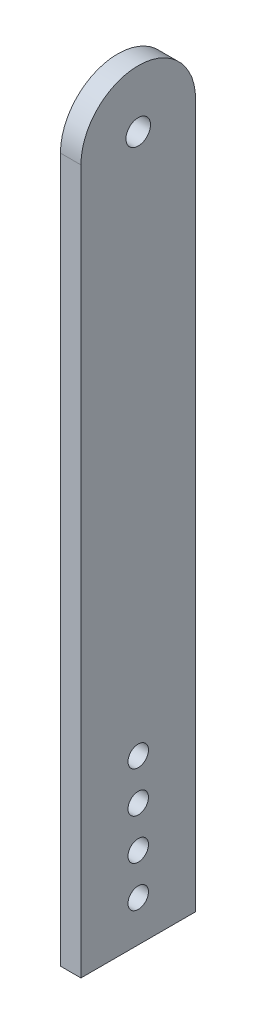
ISO-10303-21;
HEADER;
FILE_DESCRIPTION(('STEP AP214'),'2;1');
FILE_NAME('part.step','',(''),(''),'','','');
FILE_SCHEMA(('AUTOMOTIVE_DESIGN { 1 0 10303 214 1 1 1 1 }'));
ENDSEC;
DATA;
#1=APPLICATION_CONTEXT('core data for automotive mechanical design processes');
#2=APPLICATION_PROTOCOL_DEFINITION('international standard','automotive_design',2000,#1);
#3=PRODUCT_CONTEXT('',#1,'mechanical');
#4=PRODUCT('Part','Part','',(#3));
#5=PRODUCT_RELATED_PRODUCT_CATEGORY('part','',(#4));
#6=PRODUCT_DEFINITION_FORMATION('','',#4);
#7=PRODUCT_DEFINITION_CONTEXT('part definition',#1,'design');
#8=PRODUCT_DEFINITION('design','',#6,#7);
#9=PRODUCT_DEFINITION_SHAPE('','',#8);
#10=(LENGTH_UNIT() NAMED_UNIT(*) SI_UNIT(.MILLI.,.METRE.));
#11=(NAMED_UNIT(*) PLANE_ANGLE_UNIT() SI_UNIT($,.RADIAN.));
#12=(NAMED_UNIT(*) SI_UNIT($,.STERADIAN.) SOLID_ANGLE_UNIT());
#13=UNCERTAINTY_MEASURE_WITH_UNIT(LENGTH_MEASURE(1.E-05),#10,'distance_accuracy_value','');
#14=(GEOMETRIC_REPRESENTATION_CONTEXT(3) GLOBAL_UNCERTAINTY_ASSIGNED_CONTEXT((#13)) GLOBAL_UNIT_ASSIGNED_CONTEXT((#10,
#11,#12)) REPRESENTATION_CONTEXT('',''));
#15=CARTESIAN_POINT('',(0.,0.,0.));
#16=DIRECTION('',(0.,0.,1.));
#17=DIRECTION('',(1.,0.,0.));
#18=AXIS2_PLACEMENT_3D('',#15,#16,#17);
#19=CARTESIAN_POINT('',(2.5,96.,0.));
#20=DIRECTION('',(1.,0.,0.));
#21=DIRECTION('',(0.,0.,-1.));
#22=AXIS2_PLACEMENT_3D('',#19,#20,#21);
#23=PLANE('',#22);
#24=CARTESIAN_POINT('',(2.5,30.,0.));
#25=DIRECTION('',(1.,0.,0.));
#26=DIRECTION('',(0.,0.,-1.));
#27=AXIS2_PLACEMENT_3D('',#24,#25,#26);
#28=CIRCLE('',#27,1.25);
#29=CARTESIAN_POINT('',(2.5,30.,-1.24999999999995));
#30=VERTEX_POINT('',#29);
#31=EDGE_CURVE('E199',#30,#30,#28,.T.);
#32=ORIENTED_EDGE('',*,*,#31,.F.);
#33=EDGE_LOOP('',(#32));
#34=FACE_BOUND('',#33,.T.);
#35=CARTESIAN_POINT('',(2.5,20.,0.));
#36=DIRECTION('',(1.,0.,0.));
#37=DIRECTION('',(0.,0.,-1.));
#38=AXIS2_PLACEMENT_3D('',#35,#36,#37);
#39=CIRCLE('',#38,1.25);
#40=CARTESIAN_POINT('',(2.5,20.,-1.24999999999998));
#41=VERTEX_POINT('',#40);
#42=EDGE_CURVE('E187',#41,#41,#39,.T.);
#43=ORIENTED_EDGE('',*,*,#42,.F.);
#44=EDGE_LOOP('',(#43));
#45=FACE_BOUND('',#44,.T.);
#46=DIRECTION('',(0.,0.,-1.));
#47=VECTOR('',#46,1.);
#48=CARTESIAN_POINT('',(2.5,10.,7.));
#49=LINE('',#48,#47);
#50=CARTESIAN_POINT('',(2.5,10.,7.));
#51=VERTEX_POINT('',#50);
#52=CARTESIAN_POINT('',(2.5,10.,-7.));
#53=VERTEX_POINT('',#52);
#54=EDGE_CURVE('E158',#51,#53,#49,.T.);
#55=ORIENTED_EDGE('',*,*,#54,.T.);
#56=DIRECTION('',(0.,1.,0.));
#57=VECTOR('',#56,1.);
#58=CARTESIAN_POINT('',(2.5,10.,-7.));
#59=LINE('',#58,#57);
#60=CARTESIAN_POINT('',(2.5,96.,-7.));
#61=VERTEX_POINT('',#60);
#62=EDGE_CURVE('E151',#53,#61,#59,.T.);
#63=ORIENTED_EDGE('',*,*,#62,.T.);
#64=CARTESIAN_POINT('',(2.5,96.,0.));
#65=DIRECTION('',(1.,0.,0.));
#66=DIRECTION('',(0.,0.,-1.));
#67=AXIS2_PLACEMENT_3D('',#64,#65,#66);
#68=CIRCLE('',#67,7.);
#69=CARTESIAN_POINT('',(2.5,96.,7.));
#70=VERTEX_POINT('',#69);
#71=EDGE_CURVE('E157',#61,#70,#68,.T.);
#72=ORIENTED_EDGE('',*,*,#71,.T.);
#73=DIRECTION('',(0.,1.,0.));
#74=VECTOR('',#73,1.);
#75=CARTESIAN_POINT('',(2.5,10.,7.));
#76=LINE('',#75,#74);
#77=EDGE_CURVE('E167',#51,#70,#76,.T.);
#78=ORIENTED_EDGE('',*,*,#77,.F.);
#79=EDGE_LOOP('',(#55,#63,#72,#78));
#80=FACE_BOUND('',#79,.T.);
#81=CARTESIAN_POINT('',(2.5,96.,0.));
#82=DIRECTION('',(1.,0.,0.));
#83=DIRECTION('',(0.,0.,-1.));
#84=AXIS2_PLACEMENT_3D('',#81,#82,#83);
#85=CIRCLE('',#84,1.5);
#86=CARTESIAN_POINT('',(2.5,96.,-1.5));
#87=VERTEX_POINT('',#86);
#88=EDGE_CURVE('E174',#87,#87,#85,.T.);
#89=ORIENTED_EDGE('',*,*,#88,.F.);
#90=EDGE_LOOP('',(#89));
#91=FACE_BOUND('',#90,.T.);
#92=CARTESIAN_POINT('',(2.5,25.,0.));
#93=DIRECTION('',(1.,0.,0.));
#94=DIRECTION('',(0.,0.,-1.));
#95=AXIS2_PLACEMENT_3D('',#92,#93,#94);
#96=CIRCLE('',#95,1.25);
#97=CARTESIAN_POINT('',(2.5,25.,-1.24999999999997));
#98=VERTEX_POINT('',#97);
#99=EDGE_CURVE('E193',#98,#98,#96,.T.);
#100=ORIENTED_EDGE('',*,*,#99,.F.);
#101=EDGE_LOOP('',(#100));
#102=FACE_BOUND('',#101,.T.);
#103=CARTESIAN_POINT('',(2.5,15.,0.));
#104=DIRECTION('',(1.,0.,0.));
#105=DIRECTION('',(0.,0.,-1.));
#106=AXIS2_PLACEMENT_3D('',#103,#104,#105);
#107=CIRCLE('',#106,1.25);
#108=CARTESIAN_POINT('',(2.5,15.,-1.25));
#109=VERTEX_POINT('',#108);
#110=EDGE_CURVE('E205',#109,#109,#107,.T.);
#111=ORIENTED_EDGE('',*,*,#110,.F.);
#112=EDGE_LOOP('',(#111));
#113=FACE_BOUND('',#112,.T.);
#114=ADVANCED_FACE('F108',(#34,#45,#80,#91,#102,#113),#23,.T.);
#115=CARTESIAN_POINT('',(0.,96.,0.));
#116=DIRECTION('',(1.,0.,0.));
#117=DIRECTION('',(0.,0.,-1.));
#118=AXIS2_PLACEMENT_3D('',#115,#116,#117);
#119=PLANE('',#118);
#120=DIRECTION('',(0.,0.,-1.));
#121=VECTOR('',#120,1.);
#122=CARTESIAN_POINT('',(0.,10.,7.));
#123=LINE('',#122,#121);
#124=CARTESIAN_POINT('',(0.,10.,7.));
#125=VERTEX_POINT('',#124);
#126=CARTESIAN_POINT('',(0.,10.,-7.));
#127=VERTEX_POINT('',#126);
#128=EDGE_CURVE('E172',#125,#127,#123,.T.);
#129=ORIENTED_EDGE('',*,*,#128,.F.);
#130=DIRECTION('',(0.,1.,0.));
#131=VECTOR('',#130,1.);
#132=CARTESIAN_POINT('',(0.,10.,7.));
#133=LINE('',#132,#131);
#134=CARTESIAN_POINT('',(0.,96.,7.));
#135=VERTEX_POINT('',#134);
#136=EDGE_CURVE('E178',#125,#135,#133,.T.);
#137=ORIENTED_EDGE('',*,*,#136,.T.);
#138=CARTESIAN_POINT('',(0.,96.,0.));
#139=DIRECTION('',(1.,0.,0.));
#140=DIRECTION('',(0.,0.,-1.));
#141=AXIS2_PLACEMENT_3D('',#138,#139,#140);
#142=CIRCLE('',#141,7.);
#143=CARTESIAN_POINT('',(0.,96.,-7.));
#144=VERTEX_POINT('',#143);
#145=EDGE_CURVE('E176',#144,#135,#142,.T.);
#146=ORIENTED_EDGE('',*,*,#145,.F.);
#147=DIRECTION('',(0.,1.,0.));
#148=VECTOR('',#147,1.);
#149=CARTESIAN_POINT('',(0.,10.,-7.));
#150=LINE('',#149,#148);
#151=EDGE_CURVE('E163',#127,#144,#150,.T.);
#152=ORIENTED_EDGE('',*,*,#151,.F.);
#153=EDGE_LOOP('',(#129,#137,#146,#152));
#154=FACE_BOUND('',#153,.T.);
#155=CARTESIAN_POINT('',(0.,96.,0.));
#156=DIRECTION('',(1.,0.,0.));
#157=DIRECTION('',(0.,0.,-1.));
#158=AXIS2_PLACEMENT_3D('',#155,#156,#157);
#159=CIRCLE('',#158,1.5);
#160=CARTESIAN_POINT('',(0.,96.,-1.5));
#161=VERTEX_POINT('',#160);
#162=EDGE_CURVE('E184',#161,#161,#159,.T.);
#163=ORIENTED_EDGE('',*,*,#162,.T.);
#164=EDGE_LOOP('',(#163));
#165=FACE_BOUND('',#164,.T.);
#166=CARTESIAN_POINT('',(0.,20.,0.));
#167=DIRECTION('',(1.,0.,0.));
#168=DIRECTION('',(0.,0.,-1.));
#169=AXIS2_PLACEMENT_3D('',#166,#167,#168);
#170=CIRCLE('',#169,1.25);
#171=CARTESIAN_POINT('',(0.,20.,-1.24999999999998));
#172=VERTEX_POINT('',#171);
#173=EDGE_CURVE('E190',#172,#172,#170,.T.);
#174=ORIENTED_EDGE('',*,*,#173,.T.);
#175=EDGE_LOOP('',(#174));
#176=FACE_BOUND('',#175,.T.);
#177=CARTESIAN_POINT('',(0.,25.,0.));
#178=DIRECTION('',(1.,0.,0.));
#179=DIRECTION('',(0.,0.,-1.));
#180=AXIS2_PLACEMENT_3D('',#177,#178,#179);
#181=CIRCLE('',#180,1.25);
#182=CARTESIAN_POINT('',(0.,25.,-1.24999999999997));
#183=VERTEX_POINT('',#182);
#184=EDGE_CURVE('E196',#183,#183,#181,.T.);
#185=ORIENTED_EDGE('',*,*,#184,.T.);
#186=EDGE_LOOP('',(#185));
#187=FACE_BOUND('',#186,.T.);
#188=CARTESIAN_POINT('',(0.,30.,0.));
#189=DIRECTION('',(1.,0.,0.));
#190=DIRECTION('',(0.,0.,-1.));
#191=AXIS2_PLACEMENT_3D('',#188,#189,#190);
#192=CIRCLE('',#191,1.25);
#193=CARTESIAN_POINT('',(0.,30.,-1.24999999999995));
#194=VERTEX_POINT('',#193);
#195=EDGE_CURVE('E202',#194,#194,#192,.T.);
#196=ORIENTED_EDGE('',*,*,#195,.T.);
#197=EDGE_LOOP('',(#196));
#198=FACE_BOUND('',#197,.T.);
#199=CARTESIAN_POINT('',(0.,15.,0.));
#200=DIRECTION('',(1.,0.,0.));
#201=DIRECTION('',(0.,0.,-1.));
#202=AXIS2_PLACEMENT_3D('',#199,#200,#201);
#203=CIRCLE('',#202,1.25);
#204=CARTESIAN_POINT('',(0.,15.,-1.25));
#205=VERTEX_POINT('',#204);
#206=EDGE_CURVE('E208',#205,#205,#203,.T.);
#207=ORIENTED_EDGE('',*,*,#206,.T.);
#208=EDGE_LOOP('',(#207));
#209=FACE_BOUND('',#208,.T.);
#210=ADVANCED_FACE('F218',(#154,#165,#176,#187,#198,#209),#119,.F.);
#211=CARTESIAN_POINT('',(2.5,10.,7.));
#212=DIRECTION('',(0.,1.,0.));
#213=DIRECTION('',(0.,0.,1.));
#214=AXIS2_PLACEMENT_3D('',#211,#212,#213);
#215=PLANE('',#214);
#216=ORIENTED_EDGE('',*,*,#128,.T.);
#217=DIRECTION('',(-1.,0.,0.));
#218=VECTOR('',#217,1.);
#219=CARTESIAN_POINT('',(2.5,10.,-7.));
#220=LINE('',#219,#218);
#221=EDGE_CURVE('E12',#53,#127,#220,.T.);
#222=ORIENTED_EDGE('',*,*,#221,.F.);
#223=ORIENTED_EDGE('',*,*,#54,.F.);
#224=DIRECTION('',(-1.,0.,0.));
#225=VECTOR('',#224,1.);
#226=CARTESIAN_POINT('',(2.5,10.,7.));
#227=LINE('',#226,#225);
#228=EDGE_CURVE('E125',#51,#125,#227,.T.);
#229=ORIENTED_EDGE('',*,*,#228,.T.);
#230=EDGE_LOOP('',(#216,#222,#223,#229));
#231=FACE_BOUND('',#230,.T.);
#232=ADVANCED_FACE('F110',(#231),#215,.F.);
#233=CARTESIAN_POINT('',(2.5,10.,-7.));
#234=DIRECTION('',(0.,0.,1.));
#235=DIRECTION('',(1.,0.,0.));
#236=AXIS2_PLACEMENT_3D('',#233,#234,#235);
#237=PLANE('',#236);
#238=ORIENTED_EDGE('',*,*,#151,.T.);
#239=DIRECTION('',(-1.,0.,0.));
#240=VECTOR('',#239,1.);
#241=CARTESIAN_POINT('',(2.5,96.,-7.));
#242=LINE('',#241,#240);
#243=EDGE_CURVE('E117',#61,#144,#242,.T.);
#244=ORIENTED_EDGE('',*,*,#243,.F.);
#245=ORIENTED_EDGE('',*,*,#62,.F.);
#246=ORIENTED_EDGE('',*,*,#221,.T.);
#247=EDGE_LOOP('',(#238,#244,#245,#246));
#248=FACE_BOUND('',#247,.T.);
#249=ADVANCED_FACE('F162',(#248),#237,.F.);
#250=CARTESIAN_POINT('',(2.5,96.,0.));
#251=DIRECTION('',(-1.,0.,0.));
#252=DIRECTION('',(0.,0.,1.));
#253=AXIS2_PLACEMENT_3D('',#250,#251,#252);
#254=CYLINDRICAL_SURFACE('',#253,7.);
#255=ORIENTED_EDGE('',*,*,#145,.T.);
#256=DIRECTION('',(-1.,0.,0.));
#257=VECTOR('',#256,1.);
#258=CARTESIAN_POINT('',(2.5,96.,7.));
#259=LINE('',#258,#257);
#260=EDGE_CURVE('E140',#70,#135,#259,.T.);
#261=ORIENTED_EDGE('',*,*,#260,.F.);
#262=ORIENTED_EDGE('',*,*,#71,.F.);
#263=ORIENTED_EDGE('',*,*,#243,.T.);
#264=EDGE_LOOP('',(#255,#261,#262,#263));
#265=FACE_BOUND('',#264,.T.);
#266=ADVANCED_FACE('F166',(#265),#254,.T.);
#267=CARTESIAN_POINT('',(2.5,10.,7.));
#268=DIRECTION('',(0.,0.,1.));
#269=DIRECTION('',(1.,0.,0.));
#270=AXIS2_PLACEMENT_3D('',#267,#268,#269);
#271=PLANE('',#270);
#272=ORIENTED_EDGE('',*,*,#136,.F.);
#273=ORIENTED_EDGE('',*,*,#228,.F.);
#274=ORIENTED_EDGE('',*,*,#77,.T.);
#275=ORIENTED_EDGE('',*,*,#260,.T.);
#276=EDGE_LOOP('',(#272,#273,#274,#275));
#277=FACE_BOUND('',#276,.T.);
#278=ADVANCED_FACE('F231',(#277),#271,.T.);
#279=CARTESIAN_POINT('',(2.5,96.,0.));
#280=DIRECTION('',(-1.,0.,0.));
#281=DIRECTION('',(0.,0.,1.));
#282=AXIS2_PLACEMENT_3D('',#279,#280,#281);
#283=CYLINDRICAL_SURFACE('',#282,1.5);
#284=ORIENTED_EDGE('',*,*,#88,.T.);
#285=EDGE_LOOP('',(#284));
#286=FACE_BOUND('',#285,.T.);
#287=ORIENTED_EDGE('',*,*,#162,.F.);
#288=EDGE_LOOP('',(#287));
#289=FACE_BOUND('',#288,.T.);
#290=ADVANCED_FACE('F228',(#286,#289),#283,.F.);
#291=CARTESIAN_POINT('',(2.5,20.,0.));
#292=DIRECTION('',(-1.,0.,0.));
#293=DIRECTION('',(0.,0.,1.));
#294=AXIS2_PLACEMENT_3D('',#291,#292,#293);
#295=CYLINDRICAL_SURFACE('',#294,1.25);
#296=ORIENTED_EDGE('',*,*,#42,.T.);
#297=EDGE_LOOP('',(#296));
#298=FACE_BOUND('',#297,.T.);
#299=ORIENTED_EDGE('',*,*,#173,.F.);
#300=EDGE_LOOP('',(#299));
#301=FACE_BOUND('',#300,.T.);
#302=ADVANCED_FACE('F262',(#298,#301),#295,.F.);
#303=CARTESIAN_POINT('',(2.5,25.,0.));
#304=DIRECTION('',(-1.,0.,0.));
#305=DIRECTION('',(0.,0.,1.));
#306=AXIS2_PLACEMENT_3D('',#303,#304,#305);
#307=CYLINDRICAL_SURFACE('',#306,1.25);
#308=ORIENTED_EDGE('',*,*,#99,.T.);
#309=EDGE_LOOP('',(#308));
#310=FACE_BOUND('',#309,.T.);
#311=ORIENTED_EDGE('',*,*,#184,.F.);
#312=EDGE_LOOP('',(#311));
#313=FACE_BOUND('',#312,.T.);
#314=ADVANCED_FACE('F257',(#310,#313),#307,.F.);
#315=CARTESIAN_POINT('',(2.5,30.,0.));
#316=DIRECTION('',(-1.,0.,0.));
#317=DIRECTION('',(0.,0.,1.));
#318=AXIS2_PLACEMENT_3D('',#315,#316,#317);
#319=CYLINDRICAL_SURFACE('',#318,1.25);
#320=ORIENTED_EDGE('',*,*,#31,.T.);
#321=EDGE_LOOP('',(#320));
#322=FACE_BOUND('',#321,.T.);
#323=ORIENTED_EDGE('',*,*,#195,.F.);
#324=EDGE_LOOP('',(#323));
#325=FACE_BOUND('',#324,.T.);
#326=ADVANCED_FACE('F252',(#322,#325),#319,.F.);
#327=CARTESIAN_POINT('',(2.5,15.,0.));
#328=DIRECTION('',(-1.,0.,0.));
#329=DIRECTION('',(0.,0.,1.));
#330=AXIS2_PLACEMENT_3D('',#327,#328,#329);
#331=CYLINDRICAL_SURFACE('',#330,1.25);
#332=ORIENTED_EDGE('',*,*,#110,.T.);
#333=EDGE_LOOP('',(#332));
#334=FACE_BOUND('',#333,.T.);
#335=ORIENTED_EDGE('',*,*,#206,.F.);
#336=EDGE_LOOP('',(#335));
#337=FACE_BOUND('',#336,.T.);
#338=ADVANCED_FACE('F214',(#334,#337),#331,.F.);
#339=CLOSED_SHELL('',(#114,#210,#232,#249,#266,#278,#290,#302,#314,#326,#338));
#340=MANIFOLD_SOLID_BREP('B2',#339);
#341=ADVANCED_BREP_SHAPE_REPRESENTATION('',(#18,#340),#14);
#342=SHAPE_DEFINITION_REPRESENTATION(#9,#341);
ENDSEC;
END-ISO-10303-21;
